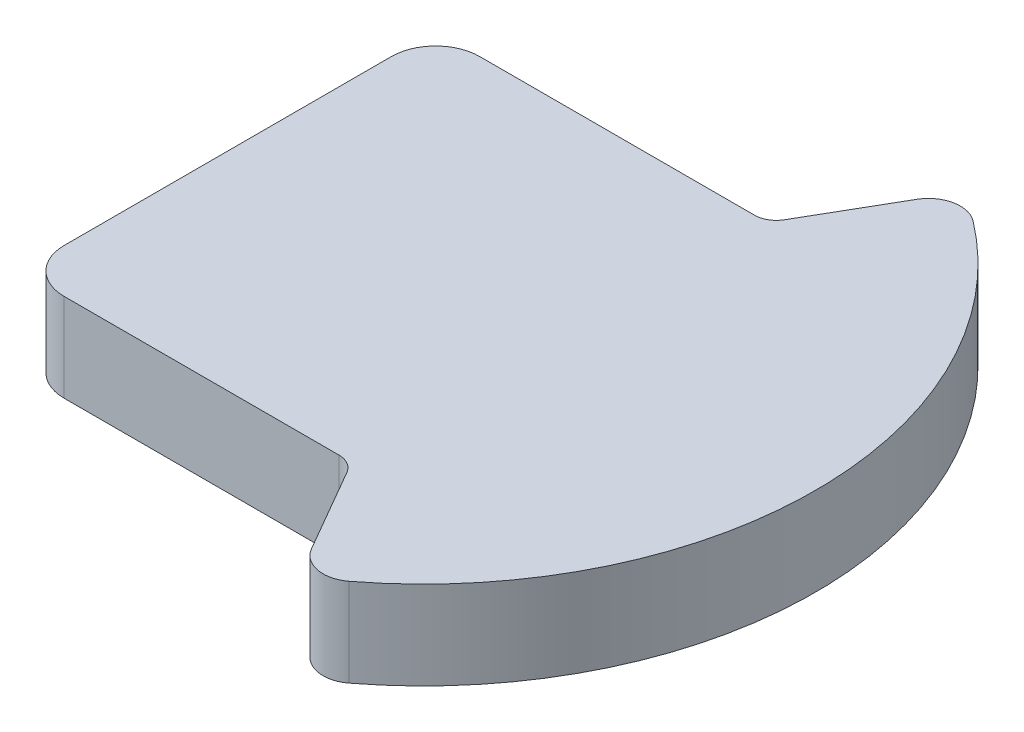
ISO-10303-21;
HEADER;
FILE_DESCRIPTION(('STEP AP214'),'2;1');
FILE_NAME('part.step','',(''),(''),'','','');
FILE_SCHEMA(('AUTOMOTIVE_DESIGN { 1 0 10303 214 1 1 1 1 }'));
ENDSEC;
DATA;
#1=APPLICATION_CONTEXT('core data for automotive mechanical design processes');
#2=APPLICATION_PROTOCOL_DEFINITION('international standard','automotive_design',2000,#1);
#3=PRODUCT_CONTEXT('',#1,'mechanical');
#4=PRODUCT('Part','Part','',(#3));
#5=PRODUCT_RELATED_PRODUCT_CATEGORY('part','',(#4));
#6=PRODUCT_DEFINITION_FORMATION('','',#4);
#7=PRODUCT_DEFINITION_CONTEXT('part definition',#1,'design');
#8=PRODUCT_DEFINITION('design','',#6,#7);
#9=PRODUCT_DEFINITION_SHAPE('','',#8);
#10=(LENGTH_UNIT() NAMED_UNIT(*) SI_UNIT(.MILLI.,.METRE.));
#11=(NAMED_UNIT(*) PLANE_ANGLE_UNIT() SI_UNIT($,.RADIAN.));
#12=(NAMED_UNIT(*) SI_UNIT($,.STERADIAN.) SOLID_ANGLE_UNIT());
#13=UNCERTAINTY_MEASURE_WITH_UNIT(LENGTH_MEASURE(1.E-05),#10,'distance_accuracy_value','');
#14=(GEOMETRIC_REPRESENTATION_CONTEXT(3) GLOBAL_UNCERTAINTY_ASSIGNED_CONTEXT((#13)) GLOBAL_UNIT_ASSIGNED_CONTEXT((#10,
#11,#12)) REPRESENTATION_CONTEXT('',''));
#15=CARTESIAN_POINT('',(0.,0.,0.));
#16=DIRECTION('',(0.,0.,1.));
#17=DIRECTION('',(1.,0.,0.));
#18=AXIS2_PLACEMENT_3D('',#15,#16,#17);
#19=CARTESIAN_POINT('',(17.7460540271706,-12.7,33.0804944317749));
#20=DIRECTION('',(0.,1.,0.));
#21=DIRECTION('',(0.,0.,1.));
#22=AXIS2_PLACEMENT_3D('',#19,#20,#21);
#23=CYLINDRICAL_SURFACE('',#22,3.175);
#24=CARTESIAN_POINT('',(17.7460540271706,0.,33.0804944317749));
#25=DIRECTION('',(0.,1.,0.));
#26=DIRECTION('',(0.,0.,1.));
#27=AXIS2_PLACEMENT_3D('',#24,#25,#26);
#28=CIRCLE('',#27,3.175);
#29=CARTESIAN_POINT('',(20.4956846841862,0.,31.4929944317749));
#30=VERTEX_POINT('',#29);
#31=CARTESIAN_POINT('',(17.7460540271706,0.,29.9054944317749));
#32=VERTEX_POINT('',#31);
#33=EDGE_CURVE('E152',#30,#32,#28,.T.);
#34=ORIENTED_EDGE('',*,*,#33,.T.);
#35=DIRECTION('',(0.,1.,0.));
#36=VECTOR('',#35,1.);
#37=CARTESIAN_POINT('',(17.7460540271706,-12.7,29.9054944317749));
#38=LINE('',#37,#36);
#39=CARTESIAN_POINT('',(17.7460540271706,-12.7,29.9054944317749));
#40=VERTEX_POINT('',#39);
#41=EDGE_CURVE('E11',#40,#32,#38,.T.);
#42=ORIENTED_EDGE('',*,*,#41,.F.);
#43=CARTESIAN_POINT('',(17.7460540271706,-12.7,33.0804944317749));
#44=DIRECTION('',(0.,1.,0.));
#45=DIRECTION('',(0.,0.,1.));
#46=AXIS2_PLACEMENT_3D('',#43,#44,#45);
#47=CIRCLE('',#46,3.175);
#48=CARTESIAN_POINT('',(20.4956846841862,-12.7,31.4929944317749));
#49=VERTEX_POINT('',#48);
#50=EDGE_CURVE('E49',#49,#40,#47,.T.);
#51=ORIENTED_EDGE('',*,*,#50,.F.);
#52=DIRECTION('',(0.,1.,0.));
#53=VECTOR('',#52,1.);
#54=CARTESIAN_POINT('',(20.4956846841862,-12.7,31.4929944317749));
#55=LINE('',#54,#53);
#56=EDGE_CURVE('E34',#49,#30,#55,.T.);
#57=ORIENTED_EDGE('',*,*,#56,.T.);
#58=EDGE_LOOP('',(#34,#42,#51,#57));
#59=FACE_BOUND('',#58,.T.);
#60=ADVANCED_FACE('F31',(#59),#23,.F.);
#61=CARTESIAN_POINT('',(-82.5130762886813,-12.7,29.9054944317749));
#62=DIRECTION('',(0.,0.,1.));
#63=DIRECTION('',(1.,0.,0.));
#64=AXIS2_PLACEMENT_3D('',#61,#62,#63);
#65=PLANE('',#64);
#66=DIRECTION('',(1.,0.,0.));
#67=VECTOR('',#66,1.);
#68=CARTESIAN_POINT('',(-82.5130762886813,0.,29.9054944317749));
#69=LINE('',#68,#67);
#70=CARTESIAN_POINT('',(-21.7956014119201,0.,29.9054944317749));
#71=VERTEX_POINT('',#70);
#72=EDGE_CURVE('E181',#71,#32,#69,.T.);
#73=ORIENTED_EDGE('',*,*,#72,.F.);
#74=DIRECTION('',(0.,1.,0.));
#75=VECTOR('',#74,1.);
#76=CARTESIAN_POINT('',(-21.7956014119201,-12.7,29.9054944317749));
#77=LINE('',#76,#75);
#78=CARTESIAN_POINT('',(-21.7956014119201,-12.7,29.9054944317749));
#79=VERTEX_POINT('',#78);
#80=EDGE_CURVE('E40',#79,#71,#77,.T.);
#81=ORIENTED_EDGE('',*,*,#80,.F.);
#82=DIRECTION('',(1.,0.,0.));
#83=VECTOR('',#82,1.);
#84=CARTESIAN_POINT('',(-82.5130762886813,-12.7,29.9054944317749));
#85=LINE('',#84,#83);
#86=EDGE_CURVE('E134',#79,#40,#85,.T.);
#87=ORIENTED_EDGE('',*,*,#86,.T.);
#88=ORIENTED_EDGE('',*,*,#41,.T.);
#89=EDGE_LOOP('',(#73,#81,#87,#88));
#90=FACE_BOUND('',#89,.T.);
#91=ADVANCED_FACE('F216',(#90),#65,.T.);
#92=CARTESIAN_POINT('',(-21.7956014119202,-12.7,23.5554944317749));
#93=DIRECTION('',(0.,1.,0.));
#94=DIRECTION('',(0.,0.,1.));
#95=AXIS2_PLACEMENT_3D('',#92,#93,#94);
#96=CYLINDRICAL_SURFACE('',#95,6.35);
#97=CARTESIAN_POINT('',(-21.7956014119202,0.,23.5554944317749));
#98=DIRECTION('',(0.,1.,0.));
#99=DIRECTION('',(0.,0.,1.));
#100=AXIS2_PLACEMENT_3D('',#97,#98,#99);
#101=CIRCLE('',#100,6.35);
#102=CARTESIAN_POINT('',(-28.1456014119202,0.,23.5554944317748));
#103=VERTEX_POINT('',#102);
#104=EDGE_CURVE('E138',#71,#103,#101,.F.);
#105=ORIENTED_EDGE('',*,*,#104,.T.);
#106=DIRECTION('',(0.,1.,0.));
#107=VECTOR('',#106,1.);
#108=CARTESIAN_POINT('',(-28.1456014119202,-12.7,23.5554944317748));
#109=LINE('',#108,#107);
#110=CARTESIAN_POINT('',(-28.1456014119202,-12.7,23.5554944317748));
#111=VERTEX_POINT('',#110);
#112=EDGE_CURVE('E136',#111,#103,#109,.T.);
#113=ORIENTED_EDGE('',*,*,#112,.F.);
#114=CARTESIAN_POINT('',(-21.7956014119202,-12.7,23.5554944317749));
#115=DIRECTION('',(0.,1.,0.));
#116=DIRECTION('',(0.,0.,1.));
#117=AXIS2_PLACEMENT_3D('',#114,#115,#116);
#118=CIRCLE('',#117,6.35);
#119=EDGE_CURVE('E127',#79,#111,#118,.F.);
#120=ORIENTED_EDGE('',*,*,#119,.F.);
#121=ORIENTED_EDGE('',*,*,#80,.T.);
#122=EDGE_LOOP('',(#105,#113,#120,#121));
#123=FACE_BOUND('',#122,.T.);
#124=ADVANCED_FACE('F137',(#123),#96,.T.);
#125=CARTESIAN_POINT('',(-28.1456014119202,-12.7,-0.467049366842573));
#126=DIRECTION('',(-1.,0.,0.));
#127=DIRECTION('',(0.,0.,1.));
#128=AXIS2_PLACEMENT_3D('',#125,#126,#127);
#129=PLANE('',#128);
#130=DIRECTION('',(0.,0.,1.));
#131=VECTOR('',#130,1.);
#132=CARTESIAN_POINT('',(-28.1456014119202,0.,-0.467049366842573));
#133=LINE('',#132,#131);
#134=CARTESIAN_POINT('',(-28.1456014119202,0.,-23.5554944317748));
#135=VERTEX_POINT('',#134);
#136=EDGE_CURVE('E178',#135,#103,#133,.T.);
#137=ORIENTED_EDGE('',*,*,#136,.F.);
#138=DIRECTION('',(0.,1.,0.));
#139=VECTOR('',#138,1.);
#140=CARTESIAN_POINT('',(-28.1456014119202,-12.7,-23.5554944317748));
#141=LINE('',#140,#139);
#142=CARTESIAN_POINT('',(-28.1456014119202,-12.7,-23.5554944317748));
#143=VERTEX_POINT('',#142);
#144=EDGE_CURVE('E142',#143,#135,#141,.T.);
#145=ORIENTED_EDGE('',*,*,#144,.F.);
#146=DIRECTION('',(0.,0.,1.));
#147=VECTOR('',#146,1.);
#148=CARTESIAN_POINT('',(-28.1456014119202,-12.7,-0.467049366842573));
#149=LINE('',#148,#147);
#150=EDGE_CURVE('E132',#143,#111,#149,.T.);
#151=ORIENTED_EDGE('',*,*,#150,.T.);
#152=ORIENTED_EDGE('',*,*,#112,.T.);
#153=EDGE_LOOP('',(#137,#145,#151,#152));
#154=FACE_BOUND('',#153,.T.);
#155=ADVANCED_FACE('F144',(#154),#129,.T.);
#156=CARTESIAN_POINT('',(-21.7956014119202,-12.7,-23.5554944317749));
#157=DIRECTION('',(0.,1.,0.));
#158=DIRECTION('',(0.,0.,1.));
#159=AXIS2_PLACEMENT_3D('',#156,#157,#158);
#160=CYLINDRICAL_SURFACE('',#159,6.35);
#161=CARTESIAN_POINT('',(-21.7956014119202,0.,-23.5554944317749));
#162=DIRECTION('',(0.,1.,0.));
#163=DIRECTION('',(0.,0.,1.));
#164=AXIS2_PLACEMENT_3D('',#161,#162,#163);
#165=CIRCLE('',#164,6.35);
#166=CARTESIAN_POINT('',(-21.7956014119201,0.,-29.9054944317749));
#167=VERTEX_POINT('',#166);
#168=EDGE_CURVE('E175',#167,#135,#165,.T.);
#169=ORIENTED_EDGE('',*,*,#168,.F.);
#170=DIRECTION('',(0.,1.,0.));
#171=VECTOR('',#170,1.);
#172=CARTESIAN_POINT('',(-21.7956014119201,-12.7,-29.9054944317749));
#173=LINE('',#172,#171);
#174=CARTESIAN_POINT('',(-21.7956014119201,-12.7,-29.9054944317749));
#175=VERTEX_POINT('',#174);
#176=EDGE_CURVE('E186',#175,#167,#173,.T.);
#177=ORIENTED_EDGE('',*,*,#176,.F.);
#178=CARTESIAN_POINT('',(-21.7956014119202,-12.7,-23.5554944317749));
#179=DIRECTION('',(0.,1.,0.));
#180=DIRECTION('',(0.,0.,1.));
#181=AXIS2_PLACEMENT_3D('',#178,#179,#180);
#182=CIRCLE('',#181,6.35);
#183=EDGE_CURVE('E145',#175,#143,#182,.T.);
#184=ORIENTED_EDGE('',*,*,#183,.T.);
#185=ORIENTED_EDGE('',*,*,#144,.T.);
#186=EDGE_LOOP('',(#169,#177,#184,#185));
#187=FACE_BOUND('',#186,.T.);
#188=ADVANCED_FACE('F229',(#187),#160,.T.);
#189=CARTESIAN_POINT('',(-82.5130762886813,-12.7,-29.9054944317749));
#190=DIRECTION('',(0.,0.,1.));
#191=DIRECTION('',(1.,0.,0.));
#192=AXIS2_PLACEMENT_3D('',#189,#190,#191);
#193=PLANE('',#192);
#194=DIRECTION('',(1.,0.,0.));
#195=VECTOR('',#194,1.);
#196=CARTESIAN_POINT('',(-82.5130762886813,0.,-29.9054944317749));
#197=LINE('',#196,#195);
#198=CARTESIAN_POINT('',(17.7460540271706,0.,-29.9054944317749));
#199=VERTEX_POINT('',#198);
#200=EDGE_CURVE('E172',#167,#199,#197,.T.);
#201=ORIENTED_EDGE('',*,*,#200,.T.);
#202=DIRECTION('',(0.,1.,0.));
#203=VECTOR('',#202,1.);
#204=CARTESIAN_POINT('',(17.7460540271706,-12.7,-29.9054944317749));
#205=LINE('',#204,#203);
#206=CARTESIAN_POINT('',(17.7460540271706,-12.7,-29.9054944317749));
#207=VERTEX_POINT('',#206);
#208=EDGE_CURVE('E188',#207,#199,#205,.T.);
#209=ORIENTED_EDGE('',*,*,#208,.F.);
#210=DIRECTION('',(1.,0.,0.));
#211=VECTOR('',#210,1.);
#212=CARTESIAN_POINT('',(-82.5130762886813,-12.7,-29.9054944317749));
#213=LINE('',#212,#211);
#214=EDGE_CURVE('E147',#175,#207,#213,.T.);
#215=ORIENTED_EDGE('',*,*,#214,.F.);
#216=ORIENTED_EDGE('',*,*,#176,.T.);
#217=EDGE_LOOP('',(#201,#209,#215,#216));
#218=FACE_BOUND('',#217,.T.);
#219=ADVANCED_FACE('F232',(#218),#193,.F.);
#220=CARTESIAN_POINT('',(17.7460540271706,-12.7,-33.0804944317749));
#221=DIRECTION('',(0.,1.,0.));
#222=DIRECTION('',(0.,0.,1.));
#223=AXIS2_PLACEMENT_3D('',#220,#221,#222);
#224=CYLINDRICAL_SURFACE('',#223,3.175);
#225=CARTESIAN_POINT('',(17.7460540271706,0.,-33.0804944317749));
#226=DIRECTION('',(0.,1.,0.));
#227=DIRECTION('',(0.,0.,1.));
#228=AXIS2_PLACEMENT_3D('',#225,#226,#227);
#229=CIRCLE('',#228,3.175);
#230=CARTESIAN_POINT('',(20.4956846841862,0.,-31.4929944317749));
#231=VERTEX_POINT('',#230);
#232=EDGE_CURVE('E169',#231,#199,#229,.F.);
#233=ORIENTED_EDGE('',*,*,#232,.F.);
#234=DIRECTION('',(0.,1.,0.));
#235=VECTOR('',#234,1.);
#236=CARTESIAN_POINT('',(20.4956846841862,-12.7,-31.4929944317749));
#237=LINE('',#236,#235);
#238=CARTESIAN_POINT('',(20.4956846841862,-12.7,-31.4929944317749));
#239=VERTEX_POINT('',#238);
#240=EDGE_CURVE('E190',#239,#231,#237,.T.);
#241=ORIENTED_EDGE('',*,*,#240,.F.);
#242=CARTESIAN_POINT('',(17.7460540271706,-12.7,-33.0804944317749));
#243=DIRECTION('',(0.,1.,0.));
#244=DIRECTION('',(0.,0.,1.));
#245=AXIS2_PLACEMENT_3D('',#242,#243,#244);
#246=CIRCLE('',#245,3.175);
#247=EDGE_CURVE('E272',#239,#207,#246,.F.);
#248=ORIENTED_EDGE('',*,*,#247,.T.);
#249=ORIENTED_EDGE('',*,*,#208,.T.);
#250=EDGE_LOOP('',(#233,#241,#248,#249));
#251=FACE_BOUND('',#250,.T.);
#252=ADVANCED_FACE('F236',(#251),#224,.F.);
#253=CARTESIAN_POINT('',(-18.6911338603565,-12.7,36.3805662743555));
#254=DIRECTION('',(0.866025403784439,0.,0.5));
#255=DIRECTION('',(0.5,0.,-0.866025403784439));
#256=AXIS2_PLACEMENT_3D('',#253,#254,#255);
#257=PLANE('',#256);
#258=DIRECTION('',(0.5,0.,-0.866025403784439));
#259=VECTOR('',#258,1.);
#260=CARTESIAN_POINT('',(-18.6911338603565,0.,36.3805662743555));
#261=LINE('',#260,#259);
#262=CARTESIAN_POINT('',(27.4724303935857,0.,-43.5770724719431));
#263=VERTEX_POINT('',#262);
#264=EDGE_CURVE('E166',#231,#263,#261,.T.);
#265=ORIENTED_EDGE('',*,*,#264,.T.);
#266=DIRECTION('',(0.,1.,0.));
#267=VECTOR('',#266,1.);
#268=CARTESIAN_POINT('',(27.4724303935857,-12.7,-43.5770724719431));
#269=LINE('',#268,#267);
#270=CARTESIAN_POINT('',(27.4724303935857,-12.7,-43.5770724719431));
#271=VERTEX_POINT('',#270);
#272=EDGE_CURVE('E192',#271,#263,#269,.T.);
#273=ORIENTED_EDGE('',*,*,#272,.F.);
#274=DIRECTION('',(0.5,0.,-0.866025403784439));
#275=VECTOR('',#274,1.);
#276=CARTESIAN_POINT('',(-18.6911338603565,-12.7,36.3805662743555));
#277=LINE('',#276,#275);
#278=EDGE_CURVE('E267',#239,#271,#277,.T.);
#279=ORIENTED_EDGE('',*,*,#278,.F.);
#280=ORIENTED_EDGE('',*,*,#240,.T.);
#281=EDGE_LOOP('',(#265,#273,#279,#280));
#282=FACE_BOUND('',#281,.T.);
#283=ADVANCED_FACE('F240',(#282),#257,.F.);
#284=CARTESIAN_POINT('',(31.4318985396882,-12.7,-41.2910724719431));
#285=DIRECTION('',(0.,1.,0.));
#286=DIRECTION('',(0.,0.,1.));
#287=AXIS2_PLACEMENT_3D('',#284,#285,#286);
#288=CYLINDRICAL_SURFACE('',#287,4.572);
#289=CARTESIAN_POINT('',(31.4318985396882,0.,-41.2910724719431));
#290=DIRECTION('',(0.,1.,0.));
#291=DIRECTION('',(0.,0.,1.));
#292=AXIS2_PLACEMENT_3D('',#289,#290,#291);
#293=CIRCLE('',#292,4.572);
#294=CARTESIAN_POINT('',(34.2011689086744,0.,-44.9289737382579));
#295=VERTEX_POINT('',#294);
#296=EDGE_CURVE('E163',#295,#263,#293,.T.);
#297=ORIENTED_EDGE('',*,*,#296,.F.);
#298=DIRECTION('',(0.,1.,0.));
#299=VECTOR('',#298,1.);
#300=CARTESIAN_POINT('',(34.2011689086744,-12.7,-44.9289737382579));
#301=LINE('',#300,#299);
#302=CARTESIAN_POINT('',(34.2011689086744,-12.7,-44.9289737382579));
#303=VERTEX_POINT('',#302);
#304=EDGE_CURVE('E194',#303,#295,#301,.T.);
#305=ORIENTED_EDGE('',*,*,#304,.F.);
#306=CARTESIAN_POINT('',(31.4318985396882,-12.7,-41.2910724719431));
#307=DIRECTION('',(0.,1.,0.));
#308=DIRECTION('',(0.,0.,1.));
#309=AXIS2_PLACEMENT_3D('',#306,#307,#308);
#310=CIRCLE('',#309,4.572);
#311=EDGE_CURVE('E265',#303,#271,#310,.T.);
#312=ORIENTED_EDGE('',*,*,#311,.T.);
#313=ORIENTED_EDGE('',*,*,#272,.T.);
#314=EDGE_LOOP('',(#297,#305,#312,#313));
#315=FACE_BOUND('',#314,.T.);
#316=ADVANCED_FACE('F244',(#315),#288,.T.);
#317=CARTESIAN_POINT('',(0.,-12.7,0.));
#318=DIRECTION('',(0.,1.,0.));
#319=DIRECTION('',(0.,0.,1.));
#320=AXIS2_PLACEMENT_3D('',#317,#318,#319);
#321=CYLINDRICAL_SURFACE('',#320,56.4653224190985);
#322=CARTESIAN_POINT('',(0.,0.,0.));
#323=DIRECTION('',(0.,1.,0.));
#324=DIRECTION('',(0.,0.,1.));
#325=AXIS2_PLACEMENT_3D('',#322,#323,#324);
#326=CIRCLE('',#325,56.4653224190985);
#327=CARTESIAN_POINT('',(34.2011689086744,0.,44.9289737382579));
#328=VERTEX_POINT('',#327);
#329=EDGE_CURVE('E160',#328,#295,#326,.T.);
#330=ORIENTED_EDGE('',*,*,#329,.F.);
#331=DIRECTION('',(0.,1.,0.));
#332=VECTOR('',#331,1.);
#333=CARTESIAN_POINT('',(34.2011689086744,-12.7,44.9289737382579));
#334=LINE('',#333,#332);
#335=CARTESIAN_POINT('',(34.2011689086744,-12.7,44.9289737382579));
#336=VERTEX_POINT('',#335);
#337=EDGE_CURVE('E196',#336,#328,#334,.T.);
#338=ORIENTED_EDGE('',*,*,#337,.F.);
#339=CARTESIAN_POINT('',(0.,-12.7,0.));
#340=DIRECTION('',(0.,1.,0.));
#341=DIRECTION('',(0.,0.,1.));
#342=AXIS2_PLACEMENT_3D('',#339,#340,#341);
#343=CIRCLE('',#342,56.4653224190985);
#344=EDGE_CURVE('E260',#336,#303,#343,.T.);
#345=ORIENTED_EDGE('',*,*,#344,.T.);
#346=ORIENTED_EDGE('',*,*,#304,.T.);
#347=EDGE_LOOP('',(#330,#338,#345,#346));
#348=FACE_BOUND('',#347,.T.);
#349=ADVANCED_FACE('F212',(#348),#321,.T.);
#350=CARTESIAN_POINT('',(31.4318985396882,-12.7,41.2910724719431));
#351=DIRECTION('',(0.,1.,0.));
#352=DIRECTION('',(0.,0.,1.));
#353=AXIS2_PLACEMENT_3D('',#350,#351,#352);
#354=CYLINDRICAL_SURFACE('',#353,4.57199999999999);
#355=CARTESIAN_POINT('',(31.4318985396882,0.,41.2910724719431));
#356=DIRECTION('',(0.,1.,0.));
#357=DIRECTION('',(0.,0.,1.));
#358=AXIS2_PLACEMENT_3D('',#355,#356,#357);
#359=CIRCLE('',#358,4.57199999999999);
#360=CARTESIAN_POINT('',(27.4724303935858,0.,43.5770724719431));
#361=VERTEX_POINT('',#360);
#362=EDGE_CURVE('E157',#328,#361,#359,.F.);
#363=ORIENTED_EDGE('',*,*,#362,.T.);
#364=DIRECTION('',(0.,1.,0.));
#365=VECTOR('',#364,1.);
#366=CARTESIAN_POINT('',(27.4724303935858,-12.7,43.5770724719431));
#367=LINE('',#366,#365);
#368=CARTESIAN_POINT('',(27.4724303935858,-12.7,43.5770724719431));
#369=VERTEX_POINT('',#368);
#370=EDGE_CURVE('E197',#369,#361,#367,.T.);
#371=ORIENTED_EDGE('',*,*,#370,.F.);
#372=CARTESIAN_POINT('',(31.4318985396882,-12.7,41.2910724719431));
#373=DIRECTION('',(0.,1.,0.));
#374=DIRECTION('',(0.,0.,1.));
#375=AXIS2_PLACEMENT_3D('',#372,#373,#374);
#376=CIRCLE('',#375,4.57199999999999);
#377=EDGE_CURVE('E258',#336,#369,#376,.F.);
#378=ORIENTED_EDGE('',*,*,#377,.F.);
#379=ORIENTED_EDGE('',*,*,#337,.T.);
#380=EDGE_LOOP('',(#363,#371,#378,#379));
#381=FACE_BOUND('',#380,.T.);
#382=ADVANCED_FACE('F206',(#381),#354,.T.);
#383=CARTESIAN_POINT('',(-19.0956104768637,-12.7,-37.0811403246193));
#384=DIRECTION('',(-0.866025403784439,0.,0.5));
#385=DIRECTION('',(0.5,0.,0.866025403784439));
#386=AXIS2_PLACEMENT_3D('',#383,#384,#385);
#387=PLANE('',#386);
#388=DIRECTION('',(0.5,0.,0.866025403784439));
#389=VECTOR('',#388,1.);
#390=CARTESIAN_POINT('',(-19.0956104768637,0.,-37.0811403246193));
#391=LINE('',#390,#389);
#392=EDGE_CURVE('E154',#30,#361,#391,.T.);
#393=ORIENTED_EDGE('',*,*,#392,.F.);
#394=ORIENTED_EDGE('',*,*,#56,.F.);
#395=DIRECTION('',(0.5,0.,0.866025403784439));
#396=VECTOR('',#395,1.);
#397=CARTESIAN_POINT('',(-19.0956104768637,-12.7,-37.0811403246193));
#398=LINE('',#397,#396);
#399=EDGE_CURVE('E261',#49,#369,#398,.T.);
#400=ORIENTED_EDGE('',*,*,#399,.T.);
#401=ORIENTED_EDGE('',*,*,#370,.T.);
#402=EDGE_LOOP('',(#393,#394,#400,#401));
#403=FACE_BOUND('',#402,.T.);
#404=ADVANCED_FACE('F204',(#403),#387,.T.);
#405=CARTESIAN_POINT('',(-82.5130762886813,-12.7,-0.467049366842565));
#406=DIRECTION('',(0.,1.,0.));
#407=DIRECTION('',(0.,0.,1.));
#408=AXIS2_PLACEMENT_3D('',#405,#406,#407);
#409=PLANE('',#408);
#410=ORIENTED_EDGE('',*,*,#50,.T.);
#411=ORIENTED_EDGE('',*,*,#86,.F.);
#412=ORIENTED_EDGE('',*,*,#119,.T.);
#413=ORIENTED_EDGE('',*,*,#150,.F.);
#414=ORIENTED_EDGE('',*,*,#183,.F.);
#415=ORIENTED_EDGE('',*,*,#214,.T.);
#416=ORIENTED_EDGE('',*,*,#247,.F.);
#417=ORIENTED_EDGE('',*,*,#278,.T.);
#418=ORIENTED_EDGE('',*,*,#311,.F.);
#419=ORIENTED_EDGE('',*,*,#344,.F.);
#420=ORIENTED_EDGE('',*,*,#377,.T.);
#421=ORIENTED_EDGE('',*,*,#399,.F.);
#422=EDGE_LOOP('',(#410,#411,#412,#413,#414,#415,#416,#417,#418,#419,#420,#421));
#423=FACE_BOUND('',#422,.T.);
#424=ADVANCED_FACE('F129',(#423),#409,.F.);
#425=CARTESIAN_POINT('',(-82.5130762886813,0.,-0.467049366842565));
#426=DIRECTION('',(0.,1.,0.));
#427=DIRECTION('',(0.,0.,1.));
#428=AXIS2_PLACEMENT_3D('',#425,#426,#427);
#429=PLANE('',#428);
#430=ORIENTED_EDGE('',*,*,#33,.F.);
#431=ORIENTED_EDGE('',*,*,#392,.T.);
#432=ORIENTED_EDGE('',*,*,#362,.F.);
#433=ORIENTED_EDGE('',*,*,#329,.T.);
#434=ORIENTED_EDGE('',*,*,#296,.T.);
#435=ORIENTED_EDGE('',*,*,#264,.F.);
#436=ORIENTED_EDGE('',*,*,#232,.T.);
#437=ORIENTED_EDGE('',*,*,#200,.F.);
#438=ORIENTED_EDGE('',*,*,#168,.T.);
#439=ORIENTED_EDGE('',*,*,#136,.T.);
#440=ORIENTED_EDGE('',*,*,#104,.F.);
#441=ORIENTED_EDGE('',*,*,#72,.T.);
#442=EDGE_LOOP('',(#430,#431,#432,#433,#434,#435,#436,#437,#438,#439,#440,#441));
#443=FACE_BOUND('',#442,.T.);
#444=ADVANCED_FACE('F202',(#443),#429,.T.);
#445=CLOSED_SHELL('',(#60,#91,#124,#155,#188,#219,#252,#283,#316,#349,#382,#404,#424,#444));
#446=MANIFOLD_SOLID_BREP('B2',#445);
#447=ADVANCED_BREP_SHAPE_REPRESENTATION('',(#18,#446),#14);
#448=SHAPE_DEFINITION_REPRESENTATION(#9,#447);
ENDSEC;
END-ISO-10303-21;
